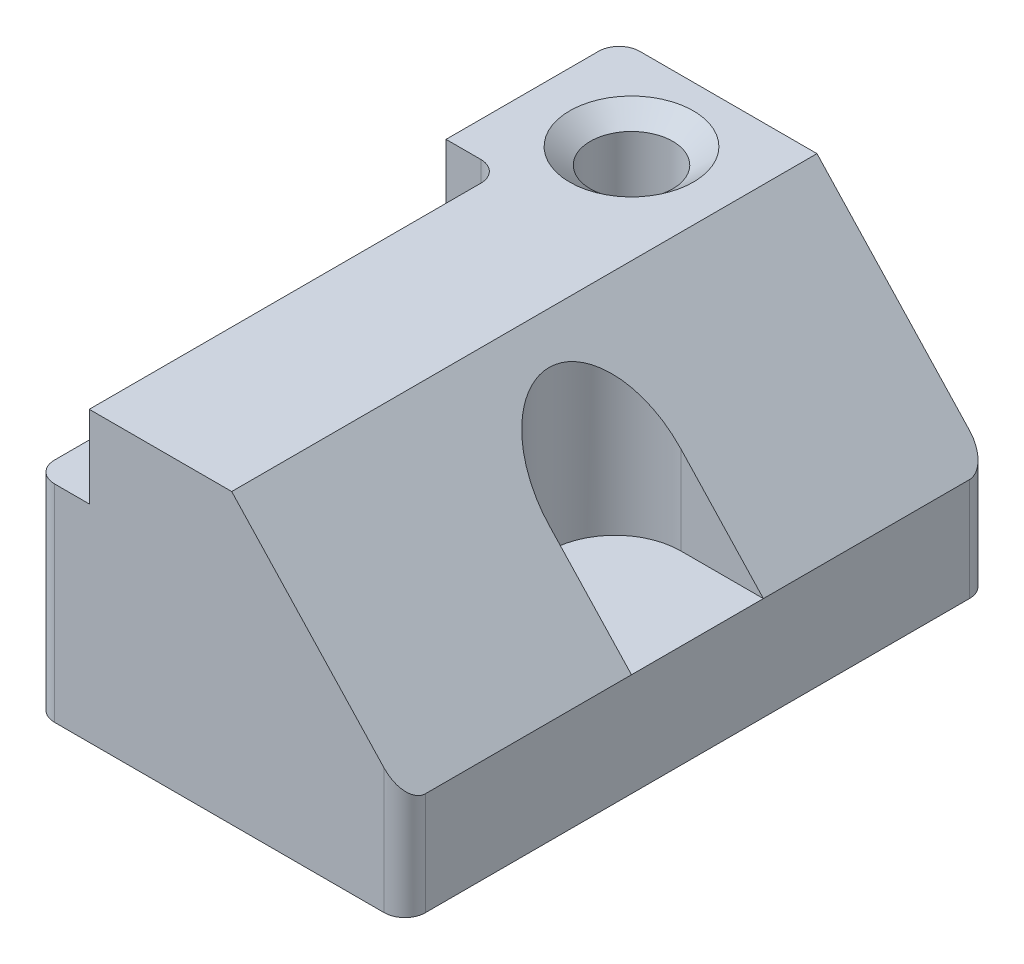
ISO-10303-21;
HEADER;
FILE_DESCRIPTION(('STEP AP214'),'2;1');
FILE_NAME('part.step','',(''),(''),'','','');
FILE_SCHEMA(('AUTOMOTIVE_DESIGN { 1 0 10303 214 1 1 1 1 }'));
ENDSEC;
DATA;
#1=APPLICATION_CONTEXT('core data for automotive mechanical design processes');
#2=APPLICATION_PROTOCOL_DEFINITION('international standard','automotive_design',2000,#1);
#3=PRODUCT_CONTEXT('',#1,'mechanical');
#4=PRODUCT('Part','Part','',(#3));
#5=PRODUCT_RELATED_PRODUCT_CATEGORY('part','',(#4));
#6=PRODUCT_DEFINITION_FORMATION('','',#4);
#7=PRODUCT_DEFINITION_CONTEXT('part definition',#1,'design');
#8=PRODUCT_DEFINITION('design','',#6,#7);
#9=PRODUCT_DEFINITION_SHAPE('','',#8);
#10=(LENGTH_UNIT() NAMED_UNIT(*) SI_UNIT(.MILLI.,.METRE.));
#11=(NAMED_UNIT(*) PLANE_ANGLE_UNIT() SI_UNIT($,.RADIAN.));
#12=(NAMED_UNIT(*) SI_UNIT($,.STERADIAN.) SOLID_ANGLE_UNIT());
#13=UNCERTAINTY_MEASURE_WITH_UNIT(LENGTH_MEASURE(1.E-05),#10,'distance_accuracy_value','');
#14=(GEOMETRIC_REPRESENTATION_CONTEXT(3) GLOBAL_UNCERTAINTY_ASSIGNED_CONTEXT((#13)) GLOBAL_UNIT_ASSIGNED_CONTEXT((#10,
#11,#12)) REPRESENTATION_CONTEXT('',''));
#15=CARTESIAN_POINT('',(0.,0.,0.));
#16=DIRECTION('',(0.,0.,1.));
#17=DIRECTION('',(1.,0.,0.));
#18=AXIS2_PLACEMENT_3D('',#15,#16,#17);
#19=CARTESIAN_POINT('',(-45.,35.,-142.));
#20=DIRECTION('',(-1.,0.,0.));
#21=DIRECTION('',(0.,-1.,0.));
#22=AXIS2_PLACEMENT_3D('',#19,#20,#21);
#23=PLANE('',#22);
#24=DIRECTION('',(0.,0.,1.));
#25=VECTOR('',#24,1.);
#26=CARTESIAN_POINT('',(-45.,35.,-142.));
#27=LINE('',#26,#25);
#28=CARTESIAN_POINT('',(-45.,35.,-137.));
#29=VERTEX_POINT('',#28);
#30=CARTESIAN_POINT('',(-45.,35.,-100.));
#31=VERTEX_POINT('',#30);
#32=EDGE_CURVE('E289',#29,#31,#27,.T.);
#33=ORIENTED_EDGE('',*,*,#32,.F.);
#34=DIRECTION('',(0.,-1.,0.));
#35=VECTOR('',#34,1.);
#36=CARTESIAN_POINT('',(-45.,-35.,-137.));
#37=LINE('',#36,#35);
#38=CARTESIAN_POINT('',(-45.,-35.,-137.));
#39=VERTEX_POINT('',#38);
#40=EDGE_CURVE('E326',#29,#39,#37,.T.);
#41=ORIENTED_EDGE('',*,*,#40,.T.);
#42=DIRECTION('',(0.,0.,1.));
#43=VECTOR('',#42,1.);
#44=CARTESIAN_POINT('',(-45.,-35.,-142.));
#45=LINE('',#44,#43);
#46=CARTESIAN_POINT('',(-45.,-35.,-5.));
#47=VERTEX_POINT('',#46);
#48=EDGE_CURVE('E279',#39,#47,#45,.T.);
#49=ORIENTED_EDGE('',*,*,#48,.T.);
#50=DIRECTION('',(0.,-1.,0.));
#51=VECTOR('',#50,1.);
#52=CARTESIAN_POINT('',(-45.,35.,-5.));
#53=LINE('',#52,#51);
#54=CARTESIAN_POINT('',(-45.,15.1094677745344,-5.));
#55=VERTEX_POINT('',#54);
#56=EDGE_CURVE('E333',#47,#55,#53,.F.);
#57=ORIENTED_EDGE('',*,*,#56,.T.);
#58=DIRECTION('',(0.,0.,1.));
#59=VECTOR('',#58,1.);
#60=CARTESIAN_POINT('',(-45.,15.1094677745344,-100.));
#61=LINE('',#60,#59);
#62=CARTESIAN_POINT('',(-45.,15.1094677745344,-100.));
#63=VERTEX_POINT('',#62);
#64=EDGE_CURVE('E250',#63,#55,#61,.T.);
#65=ORIENTED_EDGE('',*,*,#64,.F.);
#66=DIRECTION('',(0.,-1.,0.));
#67=VECTOR('',#66,1.);
#68=CARTESIAN_POINT('',(-45.,15.1094677745344,-100.));
#69=LINE('',#68,#67);
#70=EDGE_CURVE('E241',#31,#63,#69,.T.);
#71=ORIENTED_EDGE('',*,*,#70,.F.);
#72=EDGE_LOOP('',(#33,#41,#49,#57,#65,#71));
#73=FACE_BOUND('',#72,.T.);
#74=ADVANCED_FACE('F78',(#73),#23,.T.);
#75=CARTESIAN_POINT('',(-45.,35.,-142.));
#76=DIRECTION('',(0.,1.,0.));
#77=DIRECTION('',(0.,0.,1.));
#78=AXIS2_PLACEMENT_3D('',#75,#76,#77);
#79=PLANE('',#78);
#80=CARTESIAN_POINT('',(-21.,35.,-121.));
#81=DIRECTION('',(0.,1.,0.));
#82=DIRECTION('',(0.,0.,1.));
#83=AXIS2_PLACEMENT_3D('',#80,#81,#82);
#84=CIRCLE('',#83,15.);
#85=CARTESIAN_POINT('',(-21.,35.,-106.));
#86=VERTEX_POINT('',#85);
#87=EDGE_CURVE('E375',#86,#86,#84,.F.);
#88=ORIENTED_EDGE('',*,*,#87,.T.);
#89=EDGE_LOOP('',(#88));
#90=FACE_BOUND('',#89,.T.);
#91=DIRECTION('',(-1.,0.,0.));
#92=VECTOR('',#91,1.);
#93=CARTESIAN_POINT('',(-45.,35.,-142.));
#94=LINE('',#93,#92);
#95=CARTESIAN_POINT('',(3.,35.,-142.));
#96=VERTEX_POINT('',#95);
#97=CARTESIAN_POINT('',(-40.,35.,-142.));
#98=VERTEX_POINT('',#97);
#99=EDGE_CURVE('E275',#96,#98,#94,.T.);
#100=ORIENTED_EDGE('',*,*,#99,.T.);
#101=CARTESIAN_POINT('',(-40.,35.,-137.));
#102=DIRECTION('',(0.,1.,0.));
#103=DIRECTION('',(0.,0.,1.));
#104=AXIS2_PLACEMENT_3D('',#101,#102,#103);
#105=CIRCLE('',#104,5.);
#106=EDGE_CURVE('E303',#98,#29,#105,.T.);
#107=ORIENTED_EDGE('',*,*,#106,.T.);
#108=ORIENTED_EDGE('',*,*,#32,.T.);
#109=DIRECTION('',(-1.,0.,0.));
#110=VECTOR('',#109,1.);
#111=CARTESIAN_POINT('',(-45.,35.,-100.));
#112=LINE('',#111,#110);
#113=CARTESIAN_POINT('',(-36.5616546481357,35.,-100.));
#114=VERTEX_POINT('',#113);
#115=EDGE_CURVE('E237',#114,#31,#112,.T.);
#116=ORIENTED_EDGE('',*,*,#115,.F.);
#117=CARTESIAN_POINT('',(-36.5616546481357,35.,-95.));
#118=DIRECTION('',(0.,1.,0.));
#119=DIRECTION('',(0.,0.,1.));
#120=AXIS2_PLACEMENT_3D('',#117,#118,#119);
#121=CIRCLE('',#120,5.);
#122=CARTESIAN_POINT('',(-31.5616546481357,35.,-95.));
#123=VERTEX_POINT('',#122);
#124=EDGE_CURVE('E358',#114,#123,#121,.F.);
#125=ORIENTED_EDGE('',*,*,#124,.T.);
#126=DIRECTION('',(0.,0.,1.));
#127=VECTOR('',#126,1.);
#128=CARTESIAN_POINT('',(-31.5616546481357,35.,-100.));
#129=LINE('',#128,#127);
#130=CARTESIAN_POINT('',(-31.5616546481357,35.,0.));
#131=VERTEX_POINT('',#130);
#132=EDGE_CURVE('E256',#123,#131,#129,.T.);
#133=ORIENTED_EDGE('',*,*,#132,.T.);
#134=DIRECTION('',(-1.,0.,0.));
#135=VECTOR('',#134,1.);
#136=CARTESIAN_POINT('',(-45.,35.,0.));
#137=LINE('',#136,#135);
#138=CARTESIAN_POINT('',(3.,35.,0.));
#139=VERTEX_POINT('',#138);
#140=EDGE_CURVE('E272',#139,#131,#137,.T.);
#141=ORIENTED_EDGE('',*,*,#140,.F.);
#142=DIRECTION('',(0.,0.,1.));
#143=VECTOR('',#142,1.);
#144=CARTESIAN_POINT('',(3.,35.,-142.));
#145=LINE('',#144,#143);
#146=EDGE_CURVE('E198',#96,#139,#145,.T.);
#147=ORIENTED_EDGE('',*,*,#146,.F.);
#148=EDGE_LOOP('',(#100,#107,#108,#116,#125,#133,#141,#147));
#149=FACE_BOUND('',#148,.T.);
#150=ADVANCED_FACE('F433',(#90,#149),#79,.T.);
#151=CARTESIAN_POINT('',(45.,-10.,-142.));
#152=DIRECTION('',(0.731055268242869,0.682318250360011,0.));
#153=DIRECTION('',(-0.682318250360011,0.731055268242869,0.));
#154=AXIS2_PLACEMENT_3D('',#151,#152,#153);
#155=PLANE('',#154);
#156=DIRECTION('',(0.,0.,1.));
#157=VECTOR('',#156,1.);
#158=CARTESIAN_POINT('',(45.,-10.,-142.));
#159=LINE('',#158,#157);
#160=CARTESIAN_POINT('',(45.,-10.,-137.));
#161=VERTEX_POINT('',#160);
#162=CARTESIAN_POINT('',(45.,-10.,-87.));
#163=VERTEX_POINT('',#162);
#164=EDGE_CURVE('E189',#161,#163,#159,.T.);
#165=ORIENTED_EDGE('',*,*,#164,.F.);
#166=CARTESIAN_POINT('',(40.,-4.64285714285715,-137.));
#167=DIRECTION('',(0.731055268242869,0.682318250360011,0.));
#168=DIRECTION('',(0.682318250360011,-0.731055268242869,0.));
#169=AXIS2_PLACEMENT_3D('',#166,#167,#168);
#170=ELLIPSE('',#169,7.327958760244,5.);
#171=CARTESIAN_POINT('',(40.,-4.64285714285715,-142.));
#172=VERTEX_POINT('',#171);
#173=EDGE_CURVE('E12',#161,#172,#170,.T.);
#174=ORIENTED_EDGE('',*,*,#173,.T.);
#175=DIRECTION('',(-0.682318250360011,0.731055268242869,0.));
#176=VECTOR('',#175,1.);
#177=CARTESIAN_POINT('',(45.,-10.,-142.));
#178=LINE('',#177,#176);
#179=EDGE_CURVE('E271',#172,#96,#178,.T.);
#180=ORIENTED_EDGE('',*,*,#179,.T.);
#181=ORIENTED_EDGE('',*,*,#146,.T.);
#182=DIRECTION('',(-0.682318250360011,0.731055268242869,0.));
#183=VECTOR('',#182,1.);
#184=CARTESIAN_POINT('',(45.,-10.,0.));
#185=LINE('',#184,#183);
#186=CARTESIAN_POINT('',(40.,-4.64285714285715,0.));
#187=VERTEX_POINT('',#186);
#188=EDGE_CURVE('E283',#187,#139,#185,.T.);
#189=ORIENTED_EDGE('',*,*,#188,.F.);
#190=CARTESIAN_POINT('',(40.,-4.64285714285715,-5.));
#191=DIRECTION('',(0.731055268242869,0.682318250360011,0.));
#192=DIRECTION('',(-0.682318250360011,0.731055268242869,0.));
#193=AXIS2_PLACEMENT_3D('',#190,#191,#192);
#194=ELLIPSE('',#193,7.327958760244,5.);
#195=CARTESIAN_POINT('',(45.,-10.,-5.));
#196=VERTEX_POINT('',#195);
#197=EDGE_CURVE('E347',#187,#196,#194,.T.);
#198=ORIENTED_EDGE('',*,*,#197,.T.);
#199=CARTESIAN_POINT('',(45.,-10.,-55.));
#200=VERTEX_POINT('',#199);
#201=EDGE_CURVE('E199',#200,#196,#159,.T.);
#202=ORIENTED_EDGE('',*,*,#201,.F.);
#203=DIRECTION('',(0.682318250360011,-0.731055268242869,0.));
#204=VECTOR('',#203,1.);
#205=CARTESIAN_POINT('',(45.,-10.,-55.));
#206=LINE('',#205,#204);
#207=CARTESIAN_POINT('',(25.,11.4285714285714,-55.));
#208=VERTEX_POINT('',#207);
#209=EDGE_CURVE('E224',#208,#200,#206,.T.);
#210=ORIENTED_EDGE('',*,*,#209,.F.);
#211=CARTESIAN_POINT('',(25.,11.4285714285714,-71.));
#212=DIRECTION('',(0.731055268242869,0.682318250360011,0.));
#213=DIRECTION('',(-0.682318250360011,0.731055268242869,0.));
#214=AXIS2_PLACEMENT_3D('',#211,#212,#213);
#215=ELLIPSE('',#214,23.4494680327808,16.);
#216=CARTESIAN_POINT('',(25.,11.4285714285714,-87.));
#217=VERTEX_POINT('',#216);
#218=EDGE_CURVE('E222',#217,#208,#215,.T.);
#219=ORIENTED_EDGE('',*,*,#218,.F.);
#220=DIRECTION('',(-0.682318250360011,0.731055268242869,0.));
#221=VECTOR('',#220,1.);
#222=CARTESIAN_POINT('',(45.,-10.,-87.));
#223=LINE('',#222,#221);
#224=EDGE_CURVE('E206',#163,#217,#223,.T.);
#225=ORIENTED_EDGE('',*,*,#224,.F.);
#226=EDGE_LOOP('',(#165,#174,#180,#181,#189,#198,#202,#210,#219,#225));
#227=FACE_BOUND('',#226,.T.);
#228=ADVANCED_FACE('F220',(#227),#155,.T.);
#229=CARTESIAN_POINT('',(45.,-35.,-142.));
#230=DIRECTION('',(1.,0.,0.));
#231=DIRECTION('',(0.,0.,-1.));
#232=AXIS2_PLACEMENT_3D('',#229,#230,#231);
#233=PLANE('',#232);
#234=DIRECTION('',(0.,0.,1.));
#235=VECTOR('',#234,1.);
#236=CARTESIAN_POINT('',(45.,-35.,-142.));
#237=LINE('',#236,#235);
#238=CARTESIAN_POINT('',(45.,-35.,-137.));
#239=VERTEX_POINT('',#238);
#240=CARTESIAN_POINT('',(45.,-35.,-5.));
#241=VERTEX_POINT('',#240);
#242=EDGE_CURVE('E297',#239,#241,#237,.T.);
#243=ORIENTED_EDGE('',*,*,#242,.F.);
#244=DIRECTION('',(0.,1.,0.));
#245=VECTOR('',#244,1.);
#246=CARTESIAN_POINT('',(45.,-10.,-137.));
#247=LINE('',#246,#245);
#248=EDGE_CURVE('E87',#239,#161,#247,.T.);
#249=ORIENTED_EDGE('',*,*,#248,.T.);
#250=ORIENTED_EDGE('',*,*,#164,.T.);
#251=DIRECTION('',(0.,0.,-1.));
#252=VECTOR('',#251,1.);
#253=CARTESIAN_POINT('',(45.,-10.,-55.));
#254=LINE('',#253,#252);
#255=EDGE_CURVE('E195',#200,#163,#254,.T.);
#256=ORIENTED_EDGE('',*,*,#255,.F.);
#257=ORIENTED_EDGE('',*,*,#201,.T.);
#258=DIRECTION('',(0.,1.,0.));
#259=VECTOR('',#258,1.);
#260=CARTESIAN_POINT('',(45.,-35.,-5.));
#261=LINE('',#260,#259);
#262=EDGE_CURVE('E343',#196,#241,#261,.F.);
#263=ORIENTED_EDGE('',*,*,#262,.T.);
#264=EDGE_LOOP('',(#243,#249,#250,#256,#257,#263));
#265=FACE_BOUND('',#264,.T.);
#266=ADVANCED_FACE('F192',(#265),#233,.T.);
#267=CARTESIAN_POINT('',(-45.,-35.,-142.));
#268=DIRECTION('',(0.,-1.,0.));
#269=DIRECTION('',(0.,0.,-1.));
#270=AXIS2_PLACEMENT_3D('',#267,#268,#269);
#271=PLANE('',#270);
#272=CARTESIAN_POINT('',(-21.,-35.,-121.));
#273=DIRECTION('',(0.,-1.,0.));
#274=DIRECTION('',(0.,0.,-1.));
#275=AXIS2_PLACEMENT_3D('',#272,#273,#274);
#276=CIRCLE('',#275,15.);
#277=CARTESIAN_POINT('',(-21.,-35.,-136.));
#278=VERTEX_POINT('',#277);
#279=EDGE_CURVE('E371',#278,#278,#276,.F.);
#280=ORIENTED_EDGE('',*,*,#279,.T.);
#281=EDGE_LOOP('',(#280));
#282=FACE_BOUND('',#281,.T.);
#283=ORIENTED_EDGE('',*,*,#48,.F.);
#284=CARTESIAN_POINT('',(-40.,-35.,-137.));
#285=DIRECTION('',(0.,-1.,0.));
#286=DIRECTION('',(0.,0.,-1.));
#287=AXIS2_PLACEMENT_3D('',#284,#285,#286);
#288=CIRCLE('',#287,5.);
#289=CARTESIAN_POINT('',(-40.,-35.,-142.));
#290=VERTEX_POINT('',#289);
#291=EDGE_CURVE('E318',#39,#290,#288,.T.);
#292=ORIENTED_EDGE('',*,*,#291,.T.);
#293=DIRECTION('',(1.,0.,0.));
#294=VECTOR('',#293,1.);
#295=CARTESIAN_POINT('',(-45.,-35.,-142.));
#296=LINE('',#295,#294);
#297=CARTESIAN_POINT('',(40.,-35.,-142.));
#298=VERTEX_POINT('',#297);
#299=EDGE_CURVE('E267',#290,#298,#296,.T.);
#300=ORIENTED_EDGE('',*,*,#299,.T.);
#301=CARTESIAN_POINT('',(40.,-35.,-137.));
#302=DIRECTION('',(0.,-1.,0.));
#303=DIRECTION('',(0.,0.,-1.));
#304=AXIS2_PLACEMENT_3D('',#301,#302,#303);
#305=CIRCLE('',#304,5.);
#306=EDGE_CURVE('E323',#298,#239,#305,.T.);
#307=ORIENTED_EDGE('',*,*,#306,.T.);
#308=ORIENTED_EDGE('',*,*,#242,.T.);
#309=CARTESIAN_POINT('',(40.,-35.,-5.));
#310=DIRECTION('',(0.,-1.,0.));
#311=DIRECTION('',(0.,0.,-1.));
#312=AXIS2_PLACEMENT_3D('',#309,#310,#311);
#313=CIRCLE('',#312,5.);
#314=CARTESIAN_POINT('',(40.,-35.,0.));
#315=VERTEX_POINT('',#314);
#316=EDGE_CURVE('E336',#241,#315,#313,.T.);
#317=ORIENTED_EDGE('',*,*,#316,.T.);
#318=DIRECTION('',(1.,0.,0.));
#319=VECTOR('',#318,1.);
#320=CARTESIAN_POINT('',(-45.,-35.,0.));
#321=LINE('',#320,#319);
#322=CARTESIAN_POINT('',(-40.,-35.,0.));
#323=VERTEX_POINT('',#322);
#324=EDGE_CURVE('E259',#323,#315,#321,.T.);
#325=ORIENTED_EDGE('',*,*,#324,.F.);
#326=CARTESIAN_POINT('',(-40.,-35.,-5.));
#327=DIRECTION('',(0.,-1.,0.));
#328=DIRECTION('',(0.,0.,-1.));
#329=AXIS2_PLACEMENT_3D('',#326,#327,#328);
#330=CIRCLE('',#329,5.);
#331=EDGE_CURVE('E339',#323,#47,#330,.T.);
#332=ORIENTED_EDGE('',*,*,#331,.T.);
#333=EDGE_LOOP('',(#283,#292,#300,#307,#308,#317,#325,#332));
#334=FACE_BOUND('',#333,.T.);
#335=ADVANCED_FACE('F408',(#282,#334),#271,.T.);
#336=CARTESIAN_POINT('',(0.,0.,-142.));
#337=DIRECTION('',(0.,0.,1.));
#338=DIRECTION('',(1.,0.,0.));
#339=AXIS2_PLACEMENT_3D('',#336,#337,#338);
#340=PLANE('',#339);
#341=ORIENTED_EDGE('',*,*,#299,.F.);
#342=DIRECTION('',(0.,-1.,0.));
#343=VECTOR('',#342,1.);
#344=CARTESIAN_POINT('',(-40.,35.,-142.));
#345=LINE('',#344,#343);
#346=EDGE_CURVE('E307',#290,#98,#345,.F.);
#347=ORIENTED_EDGE('',*,*,#346,.T.);
#348=ORIENTED_EDGE('',*,*,#99,.F.);
#349=ORIENTED_EDGE('',*,*,#179,.F.);
#350=DIRECTION('',(0.,1.,0.));
#351=VECTOR('',#350,1.);
#352=CARTESIAN_POINT('',(40.,-35.,-142.));
#353=LINE('',#352,#351);
#354=EDGE_CURVE('E312',#172,#298,#353,.F.);
#355=ORIENTED_EDGE('',*,*,#354,.T.);
#356=EDGE_LOOP('',(#341,#347,#348,#349,#355));
#357=FACE_BOUND('',#356,.T.);
#358=ADVANCED_FACE('F437',(#357),#340,.F.);
#359=CARTESIAN_POINT('',(0.,0.,0.));
#360=DIRECTION('',(0.,0.,1.));
#361=DIRECTION('',(1.,0.,0.));
#362=AXIS2_PLACEMENT_3D('',#359,#360,#361);
#363=PLANE('',#362);
#364=ORIENTED_EDGE('',*,*,#324,.T.);
#365=DIRECTION('',(0.,1.,0.));
#366=VECTOR('',#365,1.);
#367=CARTESIAN_POINT('',(40.,0.,0.));
#368=LINE('',#367,#366);
#369=EDGE_CURVE('E350',#315,#187,#368,.T.);
#370=ORIENTED_EDGE('',*,*,#369,.T.);
#371=ORIENTED_EDGE('',*,*,#188,.T.);
#372=ORIENTED_EDGE('',*,*,#140,.T.);
#373=DIRECTION('',(0.,1.,0.));
#374=VECTOR('',#373,1.);
#375=CARTESIAN_POINT('',(-31.5616546481357,35.,0.));
#376=LINE('',#375,#374);
#377=CARTESIAN_POINT('',(-31.5616546481357,15.1094677745344,0.));
#378=VERTEX_POINT('',#377);
#379=EDGE_CURVE('E242',#378,#131,#376,.T.);
#380=ORIENTED_EDGE('',*,*,#379,.F.);
#381=DIRECTION('',(1.,0.,0.));
#382=VECTOR('',#381,1.);
#383=CARTESIAN_POINT('',(-31.5616546481357,15.1094677745344,0.));
#384=LINE('',#383,#382);
#385=CARTESIAN_POINT('',(-40.,15.1094677745344,0.));
#386=VERTEX_POINT('',#385);
#387=EDGE_CURVE('E227',#386,#378,#384,.T.);
#388=ORIENTED_EDGE('',*,*,#387,.F.);
#389=DIRECTION('',(0.,-1.,0.));
#390=VECTOR('',#389,1.);
#391=CARTESIAN_POINT('',(-40.,0.,0.));
#392=LINE('',#391,#390);
#393=EDGE_CURVE('E354',#386,#323,#392,.T.);
#394=ORIENTED_EDGE('',*,*,#393,.T.);
#395=EDGE_LOOP('',(#364,#370,#371,#372,#380,#388,#394));
#396=FACE_BOUND('',#395,.T.);
#397=ADVANCED_FACE('F419',(#396),#363,.T.);
#398=CARTESIAN_POINT('',(-31.5616546481357,35.,-100.));
#399=DIRECTION('',(1.,0.,0.));
#400=DIRECTION('',(0.,0.,-1.));
#401=AXIS2_PLACEMENT_3D('',#398,#399,#400);
#402=PLANE('',#401);
#403=ORIENTED_EDGE('',*,*,#132,.F.);
#404=DIRECTION('',(0.,1.,0.));
#405=VECTOR('',#404,1.);
#406=CARTESIAN_POINT('',(-31.5616546481357,15.1094677745344,-95.));
#407=LINE('',#406,#405);
#408=CARTESIAN_POINT('',(-31.5616546481357,15.1094677745344,-95.));
#409=VERTEX_POINT('',#408);
#410=EDGE_CURVE('E364',#123,#409,#407,.F.);
#411=ORIENTED_EDGE('',*,*,#410,.T.);
#412=DIRECTION('',(0.,0.,1.));
#413=VECTOR('',#412,1.);
#414=CARTESIAN_POINT('',(-31.5616546481357,15.1094677745344,-100.));
#415=LINE('',#414,#413);
#416=EDGE_CURVE('E260',#409,#378,#415,.T.);
#417=ORIENTED_EDGE('',*,*,#416,.T.);
#418=ORIENTED_EDGE('',*,*,#379,.T.);
#419=EDGE_LOOP('',(#403,#411,#417,#418));
#420=FACE_BOUND('',#419,.T.);
#421=ADVANCED_FACE('F423',(#420),#402,.F.);
#422=CARTESIAN_POINT('',(-31.5616546481357,15.1094677745344,-100.));
#423=DIRECTION('',(0.,-1.,0.));
#424=DIRECTION('',(0.,0.,-1.));
#425=AXIS2_PLACEMENT_3D('',#422,#423,#424);
#426=PLANE('',#425);
#427=ORIENTED_EDGE('',*,*,#64,.T.);
#428=CARTESIAN_POINT('',(-40.,15.1094677745344,-5.));
#429=DIRECTION('',(0.,-1.,0.));
#430=DIRECTION('',(0.,0.,-1.));
#431=AXIS2_PLACEMENT_3D('',#428,#429,#430);
#432=CIRCLE('',#431,5.);
#433=EDGE_CURVE('E330',#55,#386,#432,.F.);
#434=ORIENTED_EDGE('',*,*,#433,.T.);
#435=ORIENTED_EDGE('',*,*,#387,.T.);
#436=ORIENTED_EDGE('',*,*,#416,.F.);
#437=CARTESIAN_POINT('',(-36.5616546481357,15.1094677745344,-95.));
#438=DIRECTION('',(0.,-1.,0.));
#439=DIRECTION('',(0.,0.,-1.));
#440=AXIS2_PLACEMENT_3D('',#437,#438,#439);
#441=CIRCLE('',#440,5.);
#442=CARTESIAN_POINT('',(-36.5616546481357,15.1094677745344,-100.));
#443=VERTEX_POINT('',#442);
#444=EDGE_CURVE('E361',#409,#443,#441,.F.);
#445=ORIENTED_EDGE('',*,*,#444,.T.);
#446=DIRECTION('',(1.,0.,0.));
#447=VECTOR('',#446,1.);
#448=CARTESIAN_POINT('',(-31.5616546481357,15.1094677745344,-100.));
#449=LINE('',#448,#447);
#450=EDGE_CURVE('E246',#63,#443,#449,.T.);
#451=ORIENTED_EDGE('',*,*,#450,.F.);
#452=EDGE_LOOP('',(#427,#434,#435,#436,#445,#451));
#453=FACE_BOUND('',#452,.T.);
#454=ADVANCED_FACE('F415',(#453),#426,.F.);
#455=CARTESIAN_POINT('',(0.,0.,-100.));
#456=DIRECTION('',(0.,0.,-1.));
#457=DIRECTION('',(-1.,0.,0.));
#458=AXIS2_PLACEMENT_3D('',#455,#456,#457);
#459=PLANE('',#458);
#460=ORIENTED_EDGE('',*,*,#450,.T.);
#461=DIRECTION('',(0.,1.,0.));
#462=VECTOR('',#461,1.);
#463=CARTESIAN_POINT('',(-36.5616546481357,35.,-100.));
#464=LINE('',#463,#462);
#465=EDGE_CURVE('E367',#443,#114,#464,.T.);
#466=ORIENTED_EDGE('',*,*,#465,.T.);
#467=ORIENTED_EDGE('',*,*,#115,.T.);
#468=ORIENTED_EDGE('',*,*,#70,.T.);
#469=EDGE_LOOP('',(#460,#466,#467,#468));
#470=FACE_BOUND('',#469,.T.);
#471=ADVANCED_FACE('F431',(#470),#459,.F.);
#472=CARTESIAN_POINT('',(-21.,-65.,-121.));
#473=DIRECTION('',(0.,1.,0.));
#474=DIRECTION('',(-1.,0.,0.));
#475=AXIS2_PLACEMENT_3D('',#472,#473,#474);
#476=CYLINDRICAL_SURFACE('',#475,10.);
#477=CARTESIAN_POINT('',(-21.,31.0935718674664,-121.));
#478=DIRECTION('',(0.,1.,0.));
#479=DIRECTION('',(0.,0.,1.));
#480=AXIS2_PLACEMENT_3D('',#477,#478,#479);
#481=CIRCLE('',#480,10.);
#482=CARTESIAN_POINT('',(-21.,31.0935718674664,-111.));
#483=VERTEX_POINT('',#482);
#484=EDGE_CURVE('E379',#483,#483,#481,.T.);
#485=ORIENTED_EDGE('',*,*,#484,.T.);
#486=EDGE_LOOP('',(#485));
#487=FACE_BOUND('',#486,.T.);
#488=CARTESIAN_POINT('',(-21.,-31.0935718674664,-121.));
#489=DIRECTION('',(0.,-1.,0.));
#490=DIRECTION('',(0.,0.,-1.));
#491=AXIS2_PLACEMENT_3D('',#488,#489,#490);
#492=CIRCLE('',#491,10.);
#493=CARTESIAN_POINT('',(-21.,-31.0935718674664,-131.));
#494=VERTEX_POINT('',#493);
#495=EDGE_CURVE('E383',#494,#494,#492,.T.);
#496=ORIENTED_EDGE('',*,*,#495,.T.);
#497=EDGE_LOOP('',(#496));
#498=FACE_BOUND('',#497,.T.);
#499=ADVANCED_FACE('F480',(#487,#498),#476,.F.);
#500=CARTESIAN_POINT('',(0.,-10.,0.));
#501=DIRECTION('',(0.,1.,0.));
#502=DIRECTION('',(0.,0.,1.));
#503=AXIS2_PLACEMENT_3D('',#500,#501,#502);
#504=PLANE('',#503);
#505=DIRECTION('',(1.,0.,0.));
#506=VECTOR('',#505,1.);
#507=CARTESIAN_POINT('',(45.,-10.,-55.));
#508=LINE('',#507,#506);
#509=CARTESIAN_POINT('',(25.,-10.,-55.));
#510=VERTEX_POINT('',#509);
#511=EDGE_CURVE('E215',#510,#200,#508,.T.);
#512=ORIENTED_EDGE('',*,*,#511,.T.);
#513=ORIENTED_EDGE('',*,*,#255,.T.);
#514=DIRECTION('',(-1.,0.,0.));
#515=VECTOR('',#514,1.);
#516=CARTESIAN_POINT('',(25.,-10.,-87.));
#517=LINE('',#516,#515);
#518=CARTESIAN_POINT('',(25.,-10.,-87.));
#519=VERTEX_POINT('',#518);
#520=EDGE_CURVE('E204',#163,#519,#517,.T.);
#521=ORIENTED_EDGE('',*,*,#520,.T.);
#522=CARTESIAN_POINT('',(25.,-10.,-71.));
#523=DIRECTION('',(0.,1.,0.));
#524=DIRECTION('',(0.,0.,-1.));
#525=AXIS2_PLACEMENT_3D('',#522,#523,#524);
#526=CIRCLE('',#525,16.);
#527=EDGE_CURVE('E212',#519,#510,#526,.T.);
#528=ORIENTED_EDGE('',*,*,#527,.T.);
#529=EDGE_LOOP('',(#512,#513,#521,#528));
#530=FACE_BOUND('',#529,.T.);
#531=ADVANCED_FACE('F214',(#530),#504,.T.);
#532=CARTESIAN_POINT('',(45.,-10.,-55.));
#533=DIRECTION('',(0.,0.,1.));
#534=DIRECTION('',(1.,0.,0.));
#535=AXIS2_PLACEMENT_3D('',#532,#533,#534);
#536=PLANE('',#535);
#537=ORIENTED_EDGE('',*,*,#209,.T.);
#538=ORIENTED_EDGE('',*,*,#511,.F.);
#539=DIRECTION('',(0.,1.,0.));
#540=VECTOR('',#539,1.);
#541=CARTESIAN_POINT('',(25.,-10.,-55.));
#542=LINE('',#541,#540);
#543=EDGE_CURVE('E391',#510,#208,#542,.T.);
#544=ORIENTED_EDGE('',*,*,#543,.T.);
#545=EDGE_LOOP('',(#537,#538,#544));
#546=FACE_BOUND('',#545,.T.);
#547=ADVANCED_FACE('F393',(#546),#536,.F.);
#548=CARTESIAN_POINT('',(25.,-10.,-71.));
#549=DIRECTION('',(0.,1.,0.));
#550=DIRECTION('',(0.,0.,1.));
#551=AXIS2_PLACEMENT_3D('',#548,#549,#550);
#552=CYLINDRICAL_SURFACE('',#551,16.);
#553=ORIENTED_EDGE('',*,*,#218,.T.);
#554=ORIENTED_EDGE('',*,*,#543,.F.);
#555=ORIENTED_EDGE('',*,*,#527,.F.);
#556=DIRECTION('',(0.,1.,0.));
#557=VECTOR('',#556,1.);
#558=CARTESIAN_POINT('',(25.,-10.,-87.));
#559=LINE('',#558,#557);
#560=EDGE_CURVE('E208',#519,#217,#559,.T.);
#561=ORIENTED_EDGE('',*,*,#560,.T.);
#562=EDGE_LOOP('',(#553,#554,#555,#561));
#563=FACE_BOUND('',#562,.T.);
#564=ADVANCED_FACE('F390',(#563),#552,.F.);
#565=CARTESIAN_POINT('',(25.,-10.,-87.));
#566=DIRECTION('',(0.,0.,-1.));
#567=DIRECTION('',(-1.,0.,0.));
#568=AXIS2_PLACEMENT_3D('',#565,#566,#567);
#569=PLANE('',#568);
#570=ORIENTED_EDGE('',*,*,#224,.T.);
#571=ORIENTED_EDGE('',*,*,#560,.F.);
#572=ORIENTED_EDGE('',*,*,#520,.F.);
#573=EDGE_LOOP('',(#570,#571,#572));
#574=FACE_BOUND('',#573,.T.);
#575=ADVANCED_FACE('F205',(#574),#569,.F.);
#576=CARTESIAN_POINT('',(-21.,31.0935718674664,-121.));
#577=DIRECTION('',(0.,1.,0.));
#578=DIRECTION('',(0.,0.,1.));
#579=AXIS2_PLACEMENT_3D('',#576,#577,#578);
#580=CONICAL_SURFACE('',#579,10.,0.907571211037054);
#581=ORIENTED_EDGE('',*,*,#87,.F.);
#582=EDGE_LOOP('',(#581));
#583=FACE_BOUND('',#582,.T.);
#584=ORIENTED_EDGE('',*,*,#484,.F.);
#585=EDGE_LOOP('',(#584));
#586=FACE_BOUND('',#585,.T.);
#587=ADVANCED_FACE('F463',(#583,#586),#580,.F.);
#588=CARTESIAN_POINT('',(-21.,-31.0935718674664,-121.));
#589=DIRECTION('',(0.,-1.,0.));
#590=DIRECTION('',(0.,0.,-1.));
#591=AXIS2_PLACEMENT_3D('',#588,#589,#590);
#592=CONICAL_SURFACE('',#591,10.,0.907571211037055);
#593=ORIENTED_EDGE('',*,*,#279,.F.);
#594=EDGE_LOOP('',(#593));
#595=FACE_BOUND('',#594,.T.);
#596=ORIENTED_EDGE('',*,*,#495,.F.);
#597=EDGE_LOOP('',(#596));
#598=FACE_BOUND('',#597,.T.);
#599=ADVANCED_FACE('F450',(#595,#598),#592,.F.);
#600=CARTESIAN_POINT('',(-36.5616546481357,0.,-95.));
#601=DIRECTION('',(0.,-1.,0.));
#602=DIRECTION('',(0.,0.,-1.));
#603=AXIS2_PLACEMENT_3D('',#600,#601,#602);
#604=CYLINDRICAL_SURFACE('',#603,5.);
#605=ORIENTED_EDGE('',*,*,#444,.F.);
#606=ORIENTED_EDGE('',*,*,#410,.F.);
#607=ORIENTED_EDGE('',*,*,#124,.F.);
#608=ORIENTED_EDGE('',*,*,#465,.F.);
#609=EDGE_LOOP('',(#605,#606,#607,#608));
#610=FACE_BOUND('',#609,.T.);
#611=ADVANCED_FACE('F428',(#610),#604,.F.);
#612=CARTESIAN_POINT('',(40.,0.,-5.));
#613=DIRECTION('',(0.,1.,0.));
#614=DIRECTION('',(0.,0.,1.));
#615=AXIS2_PLACEMENT_3D('',#612,#613,#614);
#616=CYLINDRICAL_SURFACE('',#615,5.);
#617=ORIENTED_EDGE('',*,*,#316,.F.);
#618=ORIENTED_EDGE('',*,*,#262,.F.);
#619=ORIENTED_EDGE('',*,*,#197,.F.);
#620=ORIENTED_EDGE('',*,*,#369,.F.);
#621=EDGE_LOOP('',(#617,#618,#619,#620));
#622=FACE_BOUND('',#621,.T.);
#623=ADVANCED_FACE('F441',(#622),#616,.T.);
#624=CARTESIAN_POINT('',(-40.,0.,-5.));
#625=DIRECTION('',(0.,-1.,0.));
#626=DIRECTION('',(1.,0.,0.));
#627=AXIS2_PLACEMENT_3D('',#624,#625,#626);
#628=CYLINDRICAL_SURFACE('',#627,5.);
#629=ORIENTED_EDGE('',*,*,#433,.F.);
#630=ORIENTED_EDGE('',*,*,#56,.F.);
#631=ORIENTED_EDGE('',*,*,#331,.F.);
#632=ORIENTED_EDGE('',*,*,#393,.F.);
#633=EDGE_LOOP('',(#629,#630,#631,#632));
#634=FACE_BOUND('',#633,.T.);
#635=ADVANCED_FACE('F412',(#634),#628,.T.);
#636=CARTESIAN_POINT('',(-40.,35.,-137.));
#637=DIRECTION('',(0.,1.,0.));
#638=DIRECTION('',(-1.,0.,0.));
#639=AXIS2_PLACEMENT_3D('',#636,#637,#638);
#640=CYLINDRICAL_SURFACE('',#639,5.);
#641=ORIENTED_EDGE('',*,*,#106,.F.);
#642=ORIENTED_EDGE('',*,*,#346,.F.);
#643=ORIENTED_EDGE('',*,*,#291,.F.);
#644=ORIENTED_EDGE('',*,*,#40,.F.);
#645=EDGE_LOOP('',(#641,#642,#643,#644));
#646=FACE_BOUND('',#645,.T.);
#647=ADVANCED_FACE('F435',(#646),#640,.T.);
#648=CARTESIAN_POINT('',(40.,-35.,-137.));
#649=DIRECTION('',(0.,-1.,0.));
#650=DIRECTION('',(0.,0.,-1.));
#651=AXIS2_PLACEMENT_3D('',#648,#649,#650);
#652=CYLINDRICAL_SURFACE('',#651,5.);
#653=ORIENTED_EDGE('',*,*,#306,.F.);
#654=ORIENTED_EDGE('',*,*,#354,.F.);
#655=ORIENTED_EDGE('',*,*,#173,.F.);
#656=ORIENTED_EDGE('',*,*,#248,.F.);
#657=EDGE_LOOP('',(#653,#654,#655,#656));
#658=FACE_BOUND('',#657,.T.);
#659=ADVANCED_FACE('F80',(#658),#652,.T.);
#660=CLOSED_SHELL('',(#74,#150,#228,#266,#335,#358,#397,#421,#454,#471,#499,#531,#547,#564,#575,
#587,#599,#611,#623,#635,#647,#659));
#661=MANIFOLD_SOLID_BREP('B2',#660);
#662=ADVANCED_BREP_SHAPE_REPRESENTATION('',(#18,#661),#14);
#663=SHAPE_DEFINITION_REPRESENTATION(#9,#662);
ENDSEC;
END-ISO-10303-21;
